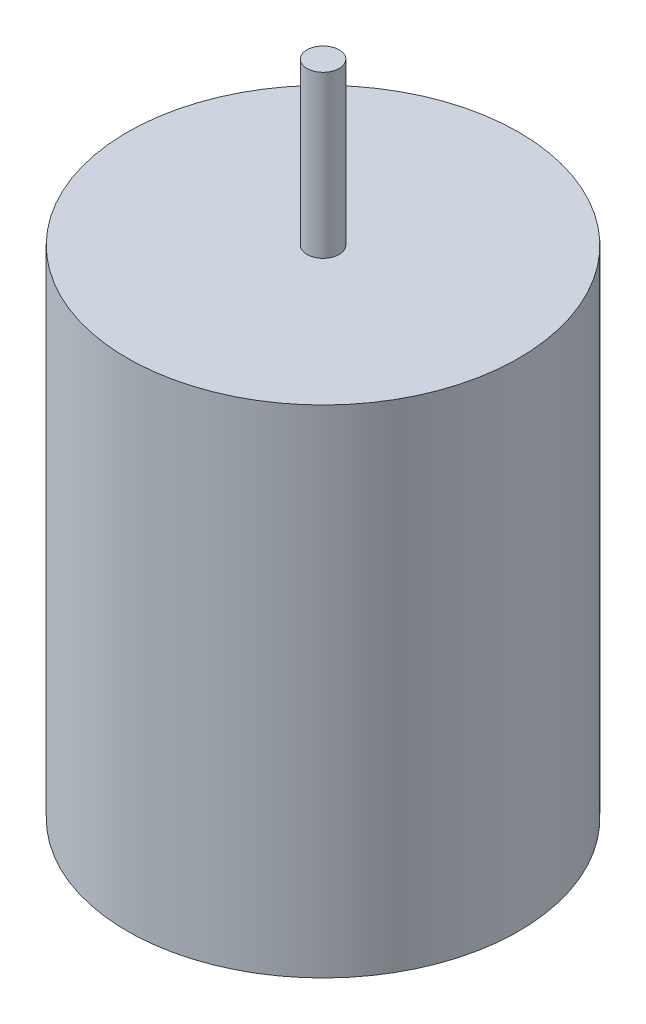
ISO-10303-21;
HEADER;
FILE_DESCRIPTION(('STEP AP214'),'2;1');
FILE_NAME('part.step','',(''),(''),'','','');
FILE_SCHEMA(('AUTOMOTIVE_DESIGN { 1 0 10303 214 1 1 1 1 }'));
ENDSEC;
DATA;
#1=APPLICATION_CONTEXT('core data for automotive mechanical design processes');
#2=APPLICATION_PROTOCOL_DEFINITION('international standard','automotive_design',2000,#1);
#3=PRODUCT_CONTEXT('',#1,'mechanical');
#4=PRODUCT('Part','Part','',(#3));
#5=PRODUCT_RELATED_PRODUCT_CATEGORY('part','',(#4));
#6=PRODUCT_DEFINITION_FORMATION('','',#4);
#7=PRODUCT_DEFINITION_CONTEXT('part definition',#1,'design');
#8=PRODUCT_DEFINITION('design','',#6,#7);
#9=PRODUCT_DEFINITION_SHAPE('','',#8);
#10=(LENGTH_UNIT() NAMED_UNIT(*) SI_UNIT(.MILLI.,.METRE.));
#11=(NAMED_UNIT(*) PLANE_ANGLE_UNIT() SI_UNIT($,.RADIAN.));
#12=(NAMED_UNIT(*) SI_UNIT($,.STERADIAN.) SOLID_ANGLE_UNIT());
#13=UNCERTAINTY_MEASURE_WITH_UNIT(LENGTH_MEASURE(1.E-05),#10,'distance_accuracy_value','');
#14=(GEOMETRIC_REPRESENTATION_CONTEXT(3) GLOBAL_UNCERTAINTY_ASSIGNED_CONTEXT((#13)) GLOBAL_UNIT_ASSIGNED_CONTEXT((#10,
#11,#12)) REPRESENTATION_CONTEXT('',''));
#15=CARTESIAN_POINT('',(0.,0.,0.));
#16=DIRECTION('',(0.,0.,1.));
#17=DIRECTION('',(1.,0.,0.));
#18=AXIS2_PLACEMENT_3D('',#15,#16,#17);
#19=CARTESIAN_POINT('',(0.,30.8,0.));
#20=DIRECTION('',(0.,-1.,0.));
#21=DIRECTION('',(0.,0.,-1.));
#22=AXIS2_PLACEMENT_3D('',#19,#20,#21);
#23=CYLINDRICAL_SURFACE('',#22,12.15);
#24=CARTESIAN_POINT('',(0.,30.8,0.));
#25=DIRECTION('',(0.,1.,0.));
#26=DIRECTION('',(0.,0.,1.));
#27=AXIS2_PLACEMENT_3D('',#24,#25,#26);
#28=CIRCLE('',#27,12.15);
#29=CARTESIAN_POINT('',(0.,30.8,-12.15));
#30=VERTEX_POINT('',#29);
#31=EDGE_CURVE('E10',#30,#30,#28,.T.);
#32=CARTESIAN_POINT('',(0.,0.,0.));
#33=DIRECTION('',(0.,1.,0.));
#34=DIRECTION('',(0.,0.,1.));
#35=AXIS2_PLACEMENT_3D('',#32,#33,#34);
#36=CIRCLE('',#35,12.15);
#37=CARTESIAN_POINT('',(0.,0.,-12.15));
#38=VERTEX_POINT('',#37);
#39=EDGE_CURVE('E34',#38,#38,#36,.T.);
#40=CARTESIAN_POINT('',(0.,30.8,-12.15));
#41=CARTESIAN_POINT('',(0.,30.4791666666667,-12.15));
#42=CARTESIAN_POINT('',(0.,30.1583333333333,-12.15));
#43=CARTESIAN_POINT('',(0.,29.5166666666667,-12.15));
#44=CARTESIAN_POINT('',(0.,29.1958333333333,-12.15));
#45=CARTESIAN_POINT('',(0.,28.5541666666667,-12.15));
#46=CARTESIAN_POINT('',(0.,28.2333333333333,-12.15));
#47=CARTESIAN_POINT('',(0.,27.5916666666667,-12.15));
#48=CARTESIAN_POINT('',(0.,27.2708333333333,-12.15));
#49=CARTESIAN_POINT('',(0.,26.6291666666667,-12.15));
#50=CARTESIAN_POINT('',(0.,26.3083333333333,-12.15));
#51=CARTESIAN_POINT('',(0.,25.6666666666667,-12.15));
#52=CARTESIAN_POINT('',(0.,25.3458333333333,-12.15));
#53=CARTESIAN_POINT('',(0.,24.7041666666667,-12.15));
#54=CARTESIAN_POINT('',(0.,24.3833333333333,-12.15));
#55=CARTESIAN_POINT('',(0.,23.7416666666667,-12.15));
#56=CARTESIAN_POINT('',(0.,23.4208333333333,-12.15));
#57=CARTESIAN_POINT('',(0.,22.7791666666667,-12.15));
#58=CARTESIAN_POINT('',(0.,22.4583333333333,-12.15));
#59=CARTESIAN_POINT('',(0.,21.8166666666667,-12.15));
#60=CARTESIAN_POINT('',(0.,21.4958333333333,-12.15));
#61=CARTESIAN_POINT('',(0.,20.8541666666667,-12.15));
#62=CARTESIAN_POINT('',(0.,20.5333333333333,-12.15));
#63=CARTESIAN_POINT('',(0.,19.8916666666667,-12.15));
#64=CARTESIAN_POINT('',(0.,19.5708333333333,-12.15));
#65=CARTESIAN_POINT('',(0.,18.9291666666667,-12.15));
#66=CARTESIAN_POINT('',(0.,18.6083333333333,-12.15));
#67=CARTESIAN_POINT('',(0.,17.9666666666667,-12.15));
#68=CARTESIAN_POINT('',(0.,17.6458333333333,-12.15));
#69=CARTESIAN_POINT('',(0.,17.0041666666667,-12.15));
#70=CARTESIAN_POINT('',(0.,16.6833333333333,-12.15));
#71=CARTESIAN_POINT('',(0.,16.0416666666667,-12.15));
#72=CARTESIAN_POINT('',(0.,15.7208333333333,-12.15));
#73=CARTESIAN_POINT('',(0.,15.0791666666667,-12.15));
#74=CARTESIAN_POINT('',(0.,14.7583333333333,-12.15));
#75=CARTESIAN_POINT('',(0.,14.1166666666667,-12.15));
#76=CARTESIAN_POINT('',(0.,13.7958333333333,-12.15));
#77=CARTESIAN_POINT('',(0.,13.1541666666667,-12.15));
#78=CARTESIAN_POINT('',(0.,12.8333333333333,-12.15));
#79=CARTESIAN_POINT('',(0.,12.1916666666667,-12.15));
#80=CARTESIAN_POINT('',(0.,11.8708333333333,-12.15));
#81=CARTESIAN_POINT('',(0.,11.2291666666667,-12.15));
#82=CARTESIAN_POINT('',(0.,10.9083333333333,-12.15));
#83=CARTESIAN_POINT('',(0.,10.2666666666667,-12.15));
#84=CARTESIAN_POINT('',(0.,9.94583333333333,-12.15));
#85=CARTESIAN_POINT('',(0.,9.30416666666666,-12.15));
#86=CARTESIAN_POINT('',(0.,8.98333333333333,-12.15));
#87=CARTESIAN_POINT('',(0.,8.34166666666666,-12.15));
#88=CARTESIAN_POINT('',(0.,8.02083333333333,-12.15));
#89=CARTESIAN_POINT('',(0.,7.37916666666666,-12.15));
#90=CARTESIAN_POINT('',(0.,7.05833333333333,-12.15));
#91=CARTESIAN_POINT('',(0.,6.41666666666666,-12.15));
#92=CARTESIAN_POINT('',(0.,6.09583333333333,-12.15));
#93=CARTESIAN_POINT('',(0.,5.45416666666667,-12.15));
#94=CARTESIAN_POINT('',(0.,5.13333333333333,-12.15));
#95=CARTESIAN_POINT('',(0.,4.49166666666666,-12.15));
#96=CARTESIAN_POINT('',(0.,4.17083333333333,-12.15));
#97=CARTESIAN_POINT('',(0.,3.52916666666666,-12.15));
#98=CARTESIAN_POINT('',(0.,3.20833333333333,-12.15));
#99=CARTESIAN_POINT('',(0.,2.56666666666666,-12.15));
#100=CARTESIAN_POINT('',(0.,2.24583333333333,-12.15));
#101=CARTESIAN_POINT('',(0.,1.60416666666666,-12.15));
#102=CARTESIAN_POINT('',(0.,1.28333333333333,-12.15));
#103=CARTESIAN_POINT('',(0.,0.641666666666664,-12.15));
#104=CARTESIAN_POINT('',(0.,0.32083333333333,-12.15));
#105=CARTESIAN_POINT('',(0.,0.,-12.15));
#106=B_SPLINE_CURVE_WITH_KNOTS('',3,(#40,#41,#42,#43,#44,#45,#46,#47,#48,#49,#50,#51,#52,#53,
#54,#55,#56,#57,#58,#59,#60,#61,#62,#63,#64,#65,#66,#67,#68,#69,#70,#71,#72,#73,#74,#75,#76,#77,
#78,#79,#80,#81,#82,#83,#84,#85,#86,#87,#88,#89,#90,#91,#92,#93,#94,#95,#96,#97,#98,#99,#100,
#101,#102,#103,#104,#105),.UNSPECIFIED.,.F.,.F.,(4,2,2,2,2,2,2,2,2,2,2,2,2,2,2,2,2,2,2,2,2,2,2,
2,2,2,2,2,2,2,2,2,4),(0.,0.962499999999998,1.925,2.8875,3.85,4.8125,5.775,6.7375,7.7,8.6625,
9.625,10.5875,11.55,12.5125,13.475,14.4375,15.4,16.3625,17.325,18.2875,19.25,20.2125,21.175,
22.1375,23.1,24.0625,25.025,25.9875,26.95,27.9125,28.875,29.8375,30.8),.UNSPECIFIED.);
#107=EDGE_CURVE('BSEAM31',#30,#38,#106,.T.);
#108=ORIENTED_EDGE('',*,*,#31,.F.);
#109=ORIENTED_EDGE('',*,*,#39,.T.);
#110=ORIENTED_EDGE('',*,*,#107,.T.);
#111=ORIENTED_EDGE('',*,*,#107,.F.);
#112=EDGE_LOOP('',(#108,#110,#109,#111));
#113=FACE_BOUND('',#112,.T.);
#114=ADVANCED_FACE('F31',(#113),#23,.T.);
#115=CARTESIAN_POINT('',(0.,30.8,0.));
#116=DIRECTION('',(0.,1.,0.));
#117=DIRECTION('',(0.,0.,1.));
#118=AXIS2_PLACEMENT_3D('',#115,#116,#117);
#119=PLANE('',#118);
#120=CARTESIAN_POINT('',(0.,30.8,0.));
#121=DIRECTION('',(0.,1.,0.));
#122=DIRECTION('',(0.,0.,1.));
#123=AXIS2_PLACEMENT_3D('',#120,#121,#122);
#124=CIRCLE('',#123,1.);
#125=CARTESIAN_POINT('',(0.,30.8,1.));
#126=VERTEX_POINT('',#125);
#127=EDGE_CURVE('E43',#126,#126,#124,.T.);
#128=ORIENTED_EDGE('',*,*,#127,.F.);
#129=EDGE_LOOP('',(#128));
#130=FACE_BOUND('',#129,.T.);
#131=ORIENTED_EDGE('',*,*,#31,.T.);
#132=EDGE_LOOP('',(#131));
#133=FACE_BOUND('',#132,.T.);
#134=ADVANCED_FACE('F58',(#130,#133),#119,.T.);
#135=CARTESIAN_POINT('',(0.,0.,0.));
#136=DIRECTION('',(0.,1.,0.));
#137=DIRECTION('',(0.,0.,1.));
#138=AXIS2_PLACEMENT_3D('',#135,#136,#137);
#139=PLANE('',#138);
#140=ORIENTED_EDGE('',*,*,#39,.F.);
#141=EDGE_LOOP('',(#140));
#142=FACE_BOUND('',#141,.T.);
#143=ADVANCED_FACE('F54',(#142),#139,.F.);
#144=CARTESIAN_POINT('',(0.,40.8,0.));
#145=DIRECTION('',(0.,-1.,0.));
#146=DIRECTION('',(0.,0.,-1.));
#147=AXIS2_PLACEMENT_3D('',#144,#145,#146);
#148=CYLINDRICAL_SURFACE('',#147,1.);
#149=CARTESIAN_POINT('',(0.,40.8,0.));
#150=DIRECTION('',(0.,1.,0.));
#151=DIRECTION('',(0.,0.,1.));
#152=AXIS2_PLACEMENT_3D('',#149,#150,#151);
#153=CIRCLE('',#152,1.);
#154=CARTESIAN_POINT('',(0.,40.8,1.));
#155=VERTEX_POINT('',#154);
#156=EDGE_CURVE('E41',#155,#155,#153,.T.);
#157=ORIENTED_EDGE('',*,*,#156,.F.);
#158=EDGE_LOOP('',(#157));
#159=FACE_BOUND('',#158,.T.);
#160=ORIENTED_EDGE('',*,*,#127,.T.);
#161=EDGE_LOOP('',(#160));
#162=FACE_BOUND('',#161,.T.);
#163=ADVANCED_FACE('F51',(#159,#162),#148,.T.);
#164=CARTESIAN_POINT('',(0.,40.8,0.));
#165=DIRECTION('',(0.,1.,0.));
#166=DIRECTION('',(0.,0.,1.));
#167=AXIS2_PLACEMENT_3D('',#164,#165,#166);
#168=PLANE('',#167);
#169=ORIENTED_EDGE('',*,*,#156,.T.);
#170=EDGE_LOOP('',(#169));
#171=FACE_BOUND('',#170,.T.);
#172=ADVANCED_FACE('F49',(#171),#168,.T.);
#173=CLOSED_SHELL('',(#114,#134,#143,#163,#172));
#174=MANIFOLD_SOLID_BREP('B2',#173);
#175=ADVANCED_BREP_SHAPE_REPRESENTATION('',(#18,#174),#14);
#176=SHAPE_DEFINITION_REPRESENTATION(#9,#175);
ENDSEC;
END-ISO-10303-21;
